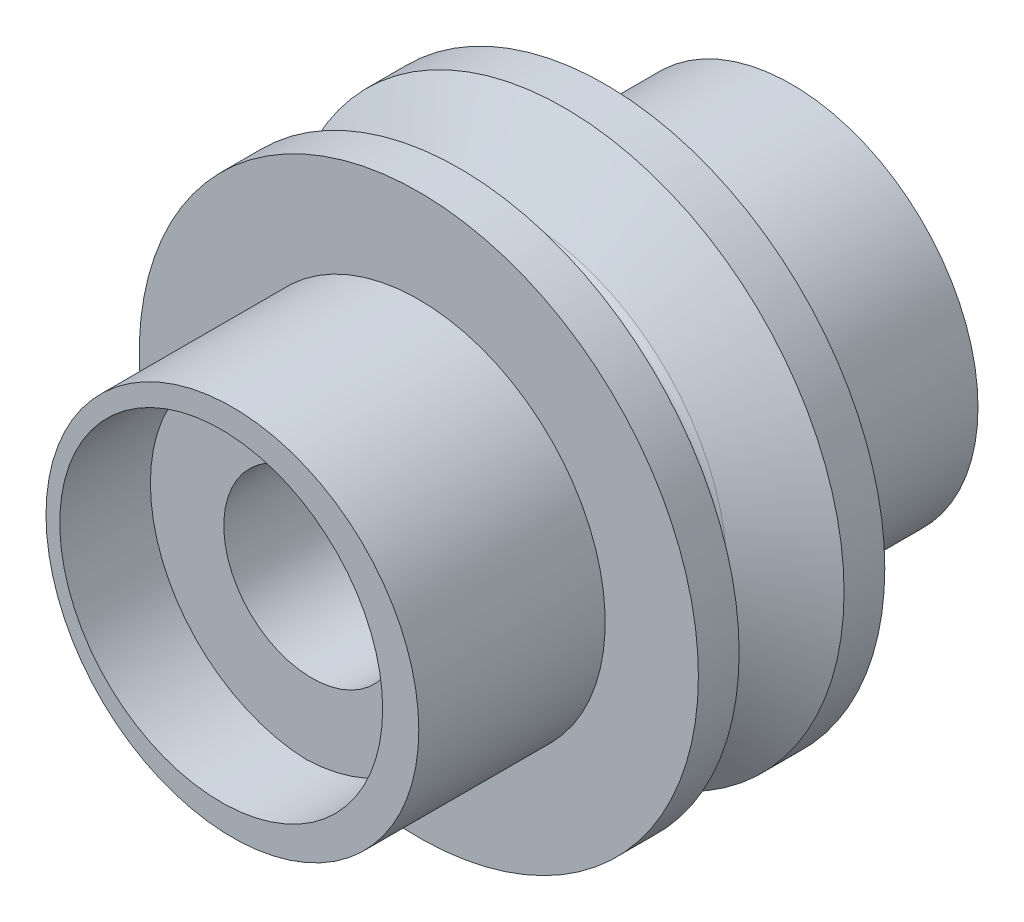
ISO-10303-21;
HEADER;
FILE_DESCRIPTION(('STEP AP214'),'2;1');
FILE_NAME('part.step','',(''),(''),'','','');
FILE_SCHEMA(('AUTOMOTIVE_DESIGN { 1 0 10303 214 1 1 1 1 }'));
ENDSEC;
DATA;
#1=APPLICATION_CONTEXT('core data for automotive mechanical design processes');
#2=APPLICATION_PROTOCOL_DEFINITION('international standard','automotive_design',2000,#1);
#3=PRODUCT_CONTEXT('',#1,'mechanical');
#4=PRODUCT('Part','Part','',(#3));
#5=PRODUCT_RELATED_PRODUCT_CATEGORY('part','',(#4));
#6=PRODUCT_DEFINITION_FORMATION('','',#4);
#7=PRODUCT_DEFINITION_CONTEXT('part definition',#1,'design');
#8=PRODUCT_DEFINITION('design','',#6,#7);
#9=PRODUCT_DEFINITION_SHAPE('','',#8);
#10=(LENGTH_UNIT() NAMED_UNIT(*) SI_UNIT(.MILLI.,.METRE.));
#11=(NAMED_UNIT(*) PLANE_ANGLE_UNIT() SI_UNIT($,.RADIAN.));
#12=(NAMED_UNIT(*) SI_UNIT($,.STERADIAN.) SOLID_ANGLE_UNIT());
#13=UNCERTAINTY_MEASURE_WITH_UNIT(LENGTH_MEASURE(1.E-05),#10,'distance_accuracy_value','');
#14=(GEOMETRIC_REPRESENTATION_CONTEXT(3) GLOBAL_UNCERTAINTY_ASSIGNED_CONTEXT((#13)) GLOBAL_UNIT_ASSIGNED_CONTEXT((#10,
#11,#12)) REPRESENTATION_CONTEXT('',''));
#15=CARTESIAN_POINT('',(0.,0.,0.));
#16=DIRECTION('',(0.,0.,1.));
#17=DIRECTION('',(1.,0.,0.));
#18=AXIS2_PLACEMENT_3D('',#15,#16,#17);
#19=CARTESIAN_POINT('',(0.,19.05,0.));
#20=DIRECTION('',(0.,0.,-1.));
#21=DIRECTION('',(-1.,0.,0.));
#22=AXIS2_PLACEMENT_3D('',#19,#20,#21);
#23=PLANE('',#22);
#24=CARTESIAN_POINT('',(-0.762,0.,0.));
#25=DIRECTION('',(0.,0.,1.));
#26=DIRECTION('',(1.,0.,0.));
#27=AXIS2_PLACEMENT_3D('',#24,#25,#26);
#28=CIRCLE('',#27,11.);
#29=CARTESIAN_POINT('',(-0.381,10.9933997926028,0.));
#30=VERTEX_POINT('',#29);
#31=CARTESIAN_POINT('',(-0.381,-10.9933997926028,0.));
#32=VERTEX_POINT('',#31);
#33=EDGE_CURVE('E56',#30,#32,#28,.T.);
#34=ORIENTED_EDGE('',*,*,#33,.T.);
#35=CARTESIAN_POINT('',(0.,0.,0.));
#36=DIRECTION('',(0.,0.,1.));
#37=DIRECTION('',(1.,0.,0.));
#38=AXIS2_PLACEMENT_3D('',#35,#36,#37);
#39=CIRCLE('',#38,11.);
#40=EDGE_CURVE('E117',#30,#32,#39,.T.);
#41=ORIENTED_EDGE('',*,*,#40,.F.);
#42=EDGE_LOOP('',(#34,#41));
#43=FACE_BOUND('',#42,.T.);
#44=ADVANCED_FACE('F35',(#43),#23,.F.);
#45=CARTESIAN_POINT('',(0.,11.,7.2874886));
#46=DIRECTION('',(0.,0.,-1.));
#47=DIRECTION('',(-1.,0.,0.));
#48=AXIS2_PLACEMENT_3D('',#45,#46,#47);
#49=PLANE('',#48);
#50=CARTESIAN_POINT('',(0.,0.,7.2874886));
#51=DIRECTION('',(0.,0.,1.));
#52=DIRECTION('',(1.,0.,0.));
#53=AXIS2_PLACEMENT_3D('',#50,#51,#52);
#54=CIRCLE('',#53,6.);
#55=CARTESIAN_POINT('',(6.,0.,7.2874886));
#56=VERTEX_POINT('',#55);
#57=EDGE_CURVE('E105',#56,#56,#54,.T.);
#58=ORIENTED_EDGE('',*,*,#57,.F.);
#59=EDGE_LOOP('',(#58));
#60=FACE_BOUND('',#59,.T.);
#61=CARTESIAN_POINT('',(-0.762,0.,7.2874886));
#62=DIRECTION('',(0.,0.,-1.));
#63=DIRECTION('',(-1.,0.,0.));
#64=AXIS2_PLACEMENT_3D('',#61,#62,#63);
#65=CIRCLE('',#64,11.);
#66=CARTESIAN_POINT('',(-0.381,10.9933997926028,7.2874886));
#67=VERTEX_POINT('',#66);
#68=CARTESIAN_POINT('',(-0.381,-10.9933997926028,7.2874886));
#69=VERTEX_POINT('',#68);
#70=EDGE_CURVE('E129',#67,#69,#65,.T.);
#71=ORIENTED_EDGE('',*,*,#70,.F.);
#72=CARTESIAN_POINT('',(0.,0.,7.2874886));
#73=DIRECTION('',(0.,0.,1.));
#74=DIRECTION('',(1.,0.,0.));
#75=AXIS2_PLACEMENT_3D('',#72,#73,#74);
#76=CIRCLE('',#75,11.);
#77=EDGE_CURVE('E49',#67,#69,#76,.T.);
#78=ORIENTED_EDGE('',*,*,#77,.T.);
#79=EDGE_LOOP('',(#71,#78));
#80=FACE_BOUND('',#79,.T.);
#81=ADVANCED_FACE('F137',(#60,#80),#49,.F.);
#82=CARTESIAN_POINT('',(0.,0.,0.));
#83=DIRECTION('',(0.,0.,1.));
#84=DIRECTION('',(1.,0.,0.));
#85=AXIS2_PLACEMENT_3D('',#82,#83,#84);
#86=CYLINDRICAL_SURFACE('',#85,11.);
#87=DIRECTION('',(0.,0.,1.));
#88=VECTOR('',#87,1.);
#89=CARTESIAN_POINT('',(-0.381,-10.9933997926028,3.6437443));
#90=LINE('',#89,#88);
#91=EDGE_CURVE('E11',#69,#32,#90,.F.);
#92=ORIENTED_EDGE('',*,*,#91,.F.);
#93=ORIENTED_EDGE('',*,*,#77,.F.);
#94=DIRECTION('',(0.,0.,1.));
#95=VECTOR('',#94,1.);
#96=CARTESIAN_POINT('',(-0.381,10.9933997926028,3.6437443));
#97=LINE('',#96,#95);
#98=EDGE_CURVE('E43',#30,#67,#97,.T.);
#99=ORIENTED_EDGE('',*,*,#98,.F.);
#100=ORIENTED_EDGE('',*,*,#40,.T.);
#101=EDGE_LOOP('',(#92,#93,#99,#100));
#102=FACE_BOUND('',#101,.T.);
#103=ADVANCED_FACE('F135',(#102),#86,.T.);
#104=CARTESIAN_POINT('',(0.,0.,0.));
#105=DIRECTION('',(0.,0.,-1.));
#106=DIRECTION('',(-1.,0.,0.));
#107=AXIS2_PLACEMENT_3D('',#104,#105,#106);
#108=CIRCLE('',#107,12.7);
#109=CARTESIAN_POINT('',(-12.7,0.,0.));
#110=VERTEX_POINT('',#109);
#111=EDGE_CURVE('E119',#110,#110,#108,.T.);
#112=ORIENTED_EDGE('',*,*,#111,.T.);
#113=EDGE_LOOP('',(#112));
#114=FACE_BOUND('',#113,.T.);
#115=CARTESIAN_POINT('',(0.,0.,0.));
#116=DIRECTION('',(0.,0.,1.));
#117=DIRECTION('',(1.,0.,0.));
#118=AXIS2_PLACEMENT_3D('',#115,#116,#117);
#119=CIRCLE('',#118,19.05);
#120=CARTESIAN_POINT('',(19.05,0.,0.));
#121=VERTEX_POINT('',#120);
#122=EDGE_CURVE('E114',#121,#121,#119,.T.);
#123=ORIENTED_EDGE('',*,*,#122,.T.);
#124=EDGE_LOOP('',(#123));
#125=FACE_BOUND('',#124,.T.);
#126=ADVANCED_FACE('F139',(#114,#125),#23,.F.);
#127=CARTESIAN_POINT('',(0.,0.,0.));
#128=DIRECTION('',(0.,0.,1.));
#129=DIRECTION('',(1.,0.,0.));
#130=AXIS2_PLACEMENT_3D('',#127,#128,#129);
#131=CYLINDRICAL_SURFACE('',#130,19.05);
#132=ORIENTED_EDGE('',*,*,#122,.F.);
#133=EDGE_LOOP('',(#132));
#134=FACE_BOUND('',#133,.T.);
#135=CARTESIAN_POINT('',(0.,0.,-2.77504713317785));
#136=DIRECTION('',(0.,0.,1.));
#137=DIRECTION('',(1.,0.,0.));
#138=AXIS2_PLACEMENT_3D('',#135,#136,#137);
#139=CIRCLE('',#138,19.05);
#140=CARTESIAN_POINT('',(19.05,0.,-2.77504713317785));
#141=VERTEX_POINT('',#140);
#142=EDGE_CURVE('E111',#141,#141,#139,.T.);
#143=ORIENTED_EDGE('',*,*,#142,.T.);
#144=EDGE_LOOP('',(#143));
#145=FACE_BOUND('',#144,.T.);
#146=ADVANCED_FACE('F148',(#134,#145),#131,.T.);
#147=CARTESIAN_POINT('',(0.,0.,-5.69008864231626));
#148=DIRECTION('',(0.,0.,1.));
#149=DIRECTION('',(1.,0.,0.));
#150=AXIS2_PLACEMENT_3D('',#147,#148,#149);
#151=CONICAL_SURFACE('',#150,14.001,1.0471975511966);
#152=ORIENTED_EDGE('',*,*,#142,.F.);
#153=EDGE_LOOP('',(#152));
#154=FACE_BOUND('',#153,.T.);
#155=CARTESIAN_POINT('',(0.,0.,-5.69008864231626));
#156=DIRECTION('',(0.,0.,1.));
#157=DIRECTION('',(1.,0.,0.));
#158=AXIS2_PLACEMENT_3D('',#155,#156,#157);
#159=CIRCLE('',#158,14.001);
#160=CARTESIAN_POINT('',(14.001,0.,-5.69008864231626));
#161=VERTEX_POINT('',#160);
#162=EDGE_CURVE('E108',#161,#161,#159,.T.);
#163=ORIENTED_EDGE('',*,*,#162,.T.);
#164=EDGE_LOOP('',(#163));
#165=FACE_BOUND('',#164,.T.);
#166=ADVANCED_FACE('F154',(#154,#165),#151,.T.);
#167=CARTESIAN_POINT('',(0.,0.,-6.35));
#168=DIRECTION('',(0.,0.,1.));
#169=DIRECTION('',(1.,0.,0.));
#170=AXIS2_PLACEMENT_3D('',#167,#168,#169);
#171=TOROIDAL_SURFACE('',#170,14.382,0.762000000000001);
#172=ORIENTED_EDGE('',*,*,#162,.F.);
#173=EDGE_LOOP('',(#172));
#174=FACE_BOUND('',#173,.T.);
#175=CARTESIAN_POINT('',(0.,0.,-7.00991135768374));
#176=DIRECTION('',(0.,0.,1.));
#177=DIRECTION('',(1.,0.,0.));
#178=AXIS2_PLACEMENT_3D('',#175,#176,#177);
#179=CIRCLE('',#178,14.001);
#180=CARTESIAN_POINT('',(14.001,0.,-7.00991135768374));
#181=VERTEX_POINT('',#180);
#182=EDGE_CURVE('E174',#181,#181,#179,.T.);
#183=ORIENTED_EDGE('',*,*,#182,.T.);
#184=EDGE_LOOP('',(#183));
#185=FACE_BOUND('',#184,.T.);
#186=ADVANCED_FACE('F164',(#174,#185),#171,.F.);
#187=CARTESIAN_POINT('',(0.,0.,0.));
#188=DIRECTION('',(0.,0.,1.));
#189=DIRECTION('',(1.,0.,0.));
#190=AXIS2_PLACEMENT_3D('',#187,#188,#189);
#191=CYLINDRICAL_SURFACE('',#190,6.);
#192=ORIENTED_EDGE('',*,*,#57,.T.);
#193=EDGE_LOOP('',(#192));
#194=FACE_BOUND('',#193,.T.);
#195=CARTESIAN_POINT('',(0.,0.,-19.9874886));
#196=DIRECTION('',(0.,0.,1.));
#197=DIRECTION('',(1.,0.,0.));
#198=AXIS2_PLACEMENT_3D('',#195,#196,#197);
#199=CIRCLE('',#198,6.);
#200=CARTESIAN_POINT('',(6.,0.,-19.9874886));
#201=VERTEX_POINT('',#200);
#202=EDGE_CURVE('E93',#201,#201,#199,.T.);
#203=ORIENTED_EDGE('',*,*,#202,.F.);
#204=EDGE_LOOP('',(#203));
#205=FACE_BOUND('',#204,.T.);
#206=ADVANCED_FACE('F170',(#194,#205),#191,.F.);
#207=CARTESIAN_POINT('',(-0.762,0.,12.7));
#208=DIRECTION('',(0.,0.,-1.));
#209=DIRECTION('',(-1.,0.,0.));
#210=AXIS2_PLACEMENT_3D('',#207,#208,#209);
#211=CYLINDRICAL_SURFACE('',#210,11.);
#212=CARTESIAN_POINT('',(-0.762,0.,12.7));
#213=DIRECTION('',(0.,0.,1.));
#214=DIRECTION('',(1.,0.,0.));
#215=AXIS2_PLACEMENT_3D('',#212,#213,#214);
#216=CIRCLE('',#215,11.);
#217=CARTESIAN_POINT('',(10.238,0.,12.7));
#218=VERTEX_POINT('',#217);
#219=EDGE_CURVE('E122',#218,#218,#216,.T.);
#220=ORIENTED_EDGE('',*,*,#219,.T.);
#221=EDGE_LOOP('',(#220));
#222=FACE_BOUND('',#221,.T.);
#223=ORIENTED_EDGE('',*,*,#70,.T.);
#224=ORIENTED_EDGE('',*,*,#91,.T.);
#225=ORIENTED_EDGE('',*,*,#33,.F.);
#226=ORIENTED_EDGE('',*,*,#98,.T.);
#227=EDGE_LOOP('',(#223,#224,#225,#226));
#228=FACE_BOUND('',#227,.T.);
#229=ADVANCED_FACE('F133',(#222,#228),#211,.F.);
#230=CARTESIAN_POINT('',(0.,0.,12.7));
#231=DIRECTION('',(0.,0.,1.));
#232=DIRECTION('',(1.,0.,0.));
#233=AXIS2_PLACEMENT_3D('',#230,#231,#232);
#234=PLANE('',#233);
#235=CARTESIAN_POINT('',(0.,0.,12.7));
#236=DIRECTION('',(0.,0.,1.));
#237=DIRECTION('',(1.,0.,0.));
#238=AXIS2_PLACEMENT_3D('',#235,#236,#237);
#239=CIRCLE('',#238,12.7);
#240=CARTESIAN_POINT('',(12.7,0.,12.7));
#241=VERTEX_POINT('',#240);
#242=EDGE_CURVE('E125',#241,#241,#239,.T.);
#243=ORIENTED_EDGE('',*,*,#242,.T.);
#244=EDGE_LOOP('',(#243));
#245=FACE_BOUND('',#244,.T.);
#246=ORIENTED_EDGE('',*,*,#219,.F.);
#247=EDGE_LOOP('',(#246));
#248=FACE_BOUND('',#247,.T.);
#249=ADVANCED_FACE('F203',(#245,#248),#234,.T.);
#250=CARTESIAN_POINT('',(0.,0.,12.7));
#251=DIRECTION('',(0.,0.,-1.));
#252=DIRECTION('',(-1.,0.,0.));
#253=AXIS2_PLACEMENT_3D('',#250,#251,#252);
#254=CYLINDRICAL_SURFACE('',#253,12.7);
#255=ORIENTED_EDGE('',*,*,#242,.F.);
#256=EDGE_LOOP('',(#255));
#257=FACE_BOUND('',#256,.T.);
#258=ORIENTED_EDGE('',*,*,#111,.F.);
#259=EDGE_LOOP('',(#258));
#260=FACE_BOUND('',#259,.T.);
#261=ADVANCED_FACE('F37',(#257,#260),#254,.T.);
#262=CARTESIAN_POINT('',(0.,19.05,-12.7));
#263=DIRECTION('',(0.,0.,1.));
#264=DIRECTION('',(-1.,0.,0.));
#265=AXIS2_PLACEMENT_3D('',#262,#263,#264);
#266=PLANE('',#265);
#267=CARTESIAN_POINT('',(-0.762,0.,-12.7));
#268=DIRECTION('',(0.,0.,1.));
#269=DIRECTION('',(1.,0.,0.));
#270=AXIS2_PLACEMENT_3D('',#267,#268,#269);
#271=CIRCLE('',#270,11.);
#272=CARTESIAN_POINT('',(-0.381,10.9933997926028,-12.7));
#273=VERTEX_POINT('',#272);
#274=CARTESIAN_POINT('',(-0.381,-10.9933997926028,-12.7));
#275=VERTEX_POINT('',#274);
#276=EDGE_CURVE('E190',#273,#275,#271,.T.);
#277=ORIENTED_EDGE('',*,*,#276,.F.);
#278=CARTESIAN_POINT('',(0.,0.,-12.7));
#279=DIRECTION('',(0.,0.,1.));
#280=DIRECTION('',(1.,0.,0.));
#281=AXIS2_PLACEMENT_3D('',#278,#279,#280);
#282=CIRCLE('',#281,11.);
#283=EDGE_CURVE('E83',#273,#275,#282,.T.);
#284=ORIENTED_EDGE('',*,*,#283,.T.);
#285=EDGE_LOOP('',(#277,#284));
#286=FACE_BOUND('',#285,.T.);
#287=ADVANCED_FACE('F193',(#286),#266,.F.);
#288=CARTESIAN_POINT('',(0.,11.,-19.9874886));
#289=DIRECTION('',(0.,0.,1.));
#290=DIRECTION('',(-1.,0.,0.));
#291=AXIS2_PLACEMENT_3D('',#288,#289,#290);
#292=PLANE('',#291);
#293=ORIENTED_EDGE('',*,*,#202,.T.);
#294=EDGE_LOOP('',(#293));
#295=FACE_BOUND('',#294,.T.);
#296=CARTESIAN_POINT('',(-0.762,0.,-19.9874886));
#297=DIRECTION('',(0.,0.,-1.));
#298=DIRECTION('',(-1.,0.,0.));
#299=AXIS2_PLACEMENT_3D('',#296,#297,#298);
#300=CIRCLE('',#299,11.);
#301=CARTESIAN_POINT('',(-0.381,10.9933997926028,-19.9874886));
#302=VERTEX_POINT('',#301);
#303=CARTESIAN_POINT('',(-0.381,-10.9933997926028,-19.9874886));
#304=VERTEX_POINT('',#303);
#305=EDGE_CURVE('E89',#302,#304,#300,.T.);
#306=ORIENTED_EDGE('',*,*,#305,.T.);
#307=CARTESIAN_POINT('',(0.,0.,-19.9874886));
#308=DIRECTION('',(0.,0.,1.));
#309=DIRECTION('',(1.,0.,0.));
#310=AXIS2_PLACEMENT_3D('',#307,#308,#309);
#311=CIRCLE('',#310,11.);
#312=EDGE_CURVE('E80',#302,#304,#311,.T.);
#313=ORIENTED_EDGE('',*,*,#312,.F.);
#314=EDGE_LOOP('',(#306,#313));
#315=FACE_BOUND('',#314,.T.);
#316=ADVANCED_FACE('F92',(#295,#315),#292,.F.);
#317=CARTESIAN_POINT('',(0.,0.,-12.7));
#318=DIRECTION('',(0.,0.,-1.));
#319=DIRECTION('',(1.,0.,0.));
#320=AXIS2_PLACEMENT_3D('',#317,#318,#319);
#321=CYLINDRICAL_SURFACE('',#320,11.);
#322=DIRECTION('',(0.,0.,-1.));
#323=VECTOR('',#322,1.);
#324=CARTESIAN_POINT('',(-0.381,-10.9933997926028,-16.3437443));
#325=LINE('',#324,#323);
#326=EDGE_CURVE('E88',#304,#275,#325,.F.);
#327=ORIENTED_EDGE('',*,*,#326,.T.);
#328=ORIENTED_EDGE('',*,*,#283,.F.);
#329=DIRECTION('',(0.,0.,-1.));
#330=VECTOR('',#329,1.);
#331=CARTESIAN_POINT('',(-0.381,10.9933997926028,-16.3437443));
#332=LINE('',#331,#330);
#333=EDGE_CURVE('E77',#273,#302,#332,.T.);
#334=ORIENTED_EDGE('',*,*,#333,.T.);
#335=ORIENTED_EDGE('',*,*,#312,.T.);
#336=EDGE_LOOP('',(#327,#328,#334,#335));
#337=FACE_BOUND('',#336,.T.);
#338=ADVANCED_FACE('F79',(#337),#321,.T.);
#339=CARTESIAN_POINT('',(0.,0.,-12.7));
#340=DIRECTION('',(0.,0.,-1.));
#341=DIRECTION('',(-1.,0.,0.));
#342=AXIS2_PLACEMENT_3D('',#339,#340,#341);
#343=CIRCLE('',#342,12.7);
#344=CARTESIAN_POINT('',(-12.7,0.,-12.7));
#345=VERTEX_POINT('',#344);
#346=EDGE_CURVE('E187',#345,#345,#343,.T.);
#347=ORIENTED_EDGE('',*,*,#346,.F.);
#348=EDGE_LOOP('',(#347));
#349=FACE_BOUND('',#348,.T.);
#350=CARTESIAN_POINT('',(0.,0.,-12.7));
#351=DIRECTION('',(0.,0.,1.));
#352=DIRECTION('',(1.,0.,0.));
#353=AXIS2_PLACEMENT_3D('',#350,#351,#352);
#354=CIRCLE('',#353,19.05);
#355=CARTESIAN_POINT('',(19.05,0.,-12.7));
#356=VERTEX_POINT('',#355);
#357=EDGE_CURVE('E179',#356,#356,#354,.T.);
#358=ORIENTED_EDGE('',*,*,#357,.F.);
#359=EDGE_LOOP('',(#358));
#360=FACE_BOUND('',#359,.T.);
#361=ADVANCED_FACE('F196',(#349,#360),#266,.F.);
#362=CARTESIAN_POINT('',(0.,0.,-12.7));
#363=DIRECTION('',(0.,0.,-1.));
#364=DIRECTION('',(1.,0.,0.));
#365=AXIS2_PLACEMENT_3D('',#362,#363,#364);
#366=CYLINDRICAL_SURFACE('',#365,19.05);
#367=ORIENTED_EDGE('',*,*,#357,.T.);
#368=EDGE_LOOP('',(#367));
#369=FACE_BOUND('',#368,.T.);
#370=CARTESIAN_POINT('',(0.,0.,-9.92495286682215));
#371=DIRECTION('',(0.,0.,1.));
#372=DIRECTION('',(1.,0.,0.));
#373=AXIS2_PLACEMENT_3D('',#370,#371,#372);
#374=CIRCLE('',#373,19.05);
#375=CARTESIAN_POINT('',(19.05,0.,-9.92495286682215));
#376=VERTEX_POINT('',#375);
#377=EDGE_CURVE('E176',#376,#376,#374,.T.);
#378=ORIENTED_EDGE('',*,*,#377,.F.);
#379=EDGE_LOOP('',(#378));
#380=FACE_BOUND('',#379,.T.);
#381=ADVANCED_FACE('F208',(#369,#380),#366,.T.);
#382=CARTESIAN_POINT('',(0.,0.,-7.00991135768374));
#383=DIRECTION('',(0.,0.,-1.));
#384=DIRECTION('',(1.,0.,0.));
#385=AXIS2_PLACEMENT_3D('',#382,#383,#384);
#386=CONICAL_SURFACE('',#385,14.001,1.0471975511966);
#387=ORIENTED_EDGE('',*,*,#377,.T.);
#388=EDGE_LOOP('',(#387));
#389=FACE_BOUND('',#388,.T.);
#390=ORIENTED_EDGE('',*,*,#182,.F.);
#391=EDGE_LOOP('',(#390));
#392=FACE_BOUND('',#391,.T.);
#393=ADVANCED_FACE('F214',(#389,#392),#386,.T.);
#394=CARTESIAN_POINT('',(-0.762,0.,-25.4));
#395=DIRECTION('',(0.,0.,1.));
#396=DIRECTION('',(-1.,0.,0.));
#397=AXIS2_PLACEMENT_3D('',#394,#395,#396);
#398=CYLINDRICAL_SURFACE('',#397,11.);
#399=CARTESIAN_POINT('',(-0.762,0.,-25.4));
#400=DIRECTION('',(0.,0.,1.));
#401=DIRECTION('',(1.,0.,0.));
#402=AXIS2_PLACEMENT_3D('',#399,#400,#401);
#403=CIRCLE('',#402,11.);
#404=CARTESIAN_POINT('',(10.238,0.,-25.4));
#405=VERTEX_POINT('',#404);
#406=EDGE_CURVE('E99',#405,#405,#403,.T.);
#407=ORIENTED_EDGE('',*,*,#406,.F.);
#408=EDGE_LOOP('',(#407));
#409=FACE_BOUND('',#408,.T.);
#410=ORIENTED_EDGE('',*,*,#305,.F.);
#411=ORIENTED_EDGE('',*,*,#333,.F.);
#412=ORIENTED_EDGE('',*,*,#276,.T.);
#413=ORIENTED_EDGE('',*,*,#326,.F.);
#414=EDGE_LOOP('',(#410,#411,#412,#413));
#415=FACE_BOUND('',#414,.T.);
#416=ADVANCED_FACE('F95',(#409,#415),#398,.F.);
#417=CARTESIAN_POINT('',(0.,0.,-25.4));
#418=DIRECTION('',(0.,0.,-1.));
#419=DIRECTION('',(1.,0.,0.));
#420=AXIS2_PLACEMENT_3D('',#417,#418,#419);
#421=PLANE('',#420);
#422=CARTESIAN_POINT('',(0.,0.,-25.4));
#423=DIRECTION('',(0.,0.,1.));
#424=DIRECTION('',(1.,0.,0.));
#425=AXIS2_PLACEMENT_3D('',#422,#423,#424);
#426=CIRCLE('',#425,12.7);
#427=CARTESIAN_POINT('',(12.7,0.,-25.4));
#428=VERTEX_POINT('',#427);
#429=EDGE_CURVE('E96',#428,#428,#426,.T.);
#430=ORIENTED_EDGE('',*,*,#429,.F.);
#431=EDGE_LOOP('',(#430));
#432=FACE_BOUND('',#431,.T.);
#433=ORIENTED_EDGE('',*,*,#406,.T.);
#434=EDGE_LOOP('',(#433));
#435=FACE_BOUND('',#434,.T.);
#436=ADVANCED_FACE('F227',(#432,#435),#421,.T.);
#437=CARTESIAN_POINT('',(0.,0.,-25.4));
#438=DIRECTION('',(0.,0.,1.));
#439=DIRECTION('',(-1.,0.,0.));
#440=AXIS2_PLACEMENT_3D('',#437,#438,#439);
#441=CYLINDRICAL_SURFACE('',#440,12.7);
#442=ORIENTED_EDGE('',*,*,#429,.T.);
#443=EDGE_LOOP('',(#442));
#444=FACE_BOUND('',#443,.T.);
#445=ORIENTED_EDGE('',*,*,#346,.T.);
#446=EDGE_LOOP('',(#445));
#447=FACE_BOUND('',#446,.T.);
#448=ADVANCED_FACE('F233',(#444,#447),#441,.T.);
#449=CLOSED_SHELL('',(#44,#81,#103,#126,#146,#166,#186,#206,#229,#249,#261,#287,#316,#338,#361,
#381,#393,#416,#436,#448));
#450=MANIFOLD_SOLID_BREP('B2',#449);
#451=ADVANCED_BREP_SHAPE_REPRESENTATION('',(#18,#450),#14);
#452=SHAPE_DEFINITION_REPRESENTATION(#9,#451);
ENDSEC;
END-ISO-10303-21;
